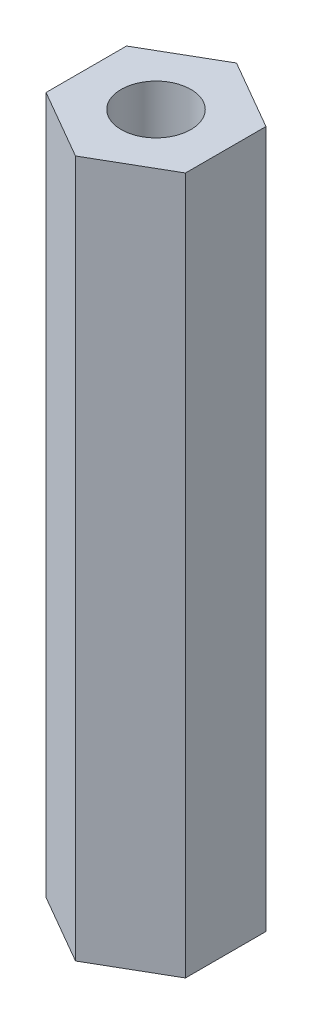
ISO-10303-21;
HEADER;
FILE_DESCRIPTION(('STEP AP214'),'2;1');
FILE_NAME('part.step','',(''),(''),'','','');
FILE_SCHEMA(('AUTOMOTIVE_DESIGN { 1 0 10303 214 1 1 1 1 }'));
ENDSEC;
DATA;
#1=APPLICATION_CONTEXT('core data for automotive mechanical design processes');
#2=APPLICATION_PROTOCOL_DEFINITION('international standard','automotive_design',2000,#1);
#3=PRODUCT_CONTEXT('',#1,'mechanical');
#4=PRODUCT('Part','Part','',(#3));
#5=PRODUCT_RELATED_PRODUCT_CATEGORY('part','',(#4));
#6=PRODUCT_DEFINITION_FORMATION('','',#4);
#7=PRODUCT_DEFINITION_CONTEXT('part definition',#1,'design');
#8=PRODUCT_DEFINITION('design','',#6,#7);
#9=PRODUCT_DEFINITION_SHAPE('','',#8);
#10=(LENGTH_UNIT() NAMED_UNIT(*) SI_UNIT(.MILLI.,.METRE.));
#11=(NAMED_UNIT(*) PLANE_ANGLE_UNIT() SI_UNIT($,.RADIAN.));
#12=(NAMED_UNIT(*) SI_UNIT($,.STERADIAN.) SOLID_ANGLE_UNIT());
#13=UNCERTAINTY_MEASURE_WITH_UNIT(LENGTH_MEASURE(1.E-05),#10,'distance_accuracy_value','');
#14=(GEOMETRIC_REPRESENTATION_CONTEXT(3) GLOBAL_UNCERTAINTY_ASSIGNED_CONTEXT((#13)) GLOBAL_UNIT_ASSIGNED_CONTEXT((#10,
#11,#12)) REPRESENTATION_CONTEXT('',''));
#15=CARTESIAN_POINT('',(0.,0.,0.));
#16=DIRECTION('',(0.,0.,1.));
#17=DIRECTION('',(1.,0.,0.));
#18=AXIS2_PLACEMENT_3D('',#15,#16,#17);
#19=CARTESIAN_POINT('',(0.,20.,0.));
#20=DIRECTION('',(0.,1.,0.));
#21=DIRECTION('',(0.,0.,1.));
#22=AXIS2_PLACEMENT_3D('',#19,#20,#21);
#23=PLANE('',#22);
#24=DIRECTION('',(0.866025403784439,0.,-0.5));
#25=VECTOR('',#24,1.);
#26=CARTESIAN_POINT('',(0.,20.,2.3094010767585));
#27=LINE('',#26,#25);
#28=CARTESIAN_POINT('',(0.,20.,2.3094010767585));
#29=VERTEX_POINT('',#28);
#30=CARTESIAN_POINT('',(2.,20.,1.15470053837925));
#31=VERTEX_POINT('',#30);
#32=EDGE_CURVE('E146',#29,#31,#27,.T.);
#33=ORIENTED_EDGE('',*,*,#32,.T.);
#34=DIRECTION('',(0.,0.,-1.));
#35=VECTOR('',#34,1.);
#36=CARTESIAN_POINT('',(2.,20.,1.15470053837925));
#37=LINE('',#36,#35);
#38=CARTESIAN_POINT('',(2.,20.,-1.15470053837925));
#39=VERTEX_POINT('',#38);
#40=EDGE_CURVE('E94',#31,#39,#37,.T.);
#41=ORIENTED_EDGE('',*,*,#40,.T.);
#42=DIRECTION('',(-0.866025403784439,0.,-0.5));
#43=VECTOR('',#42,1.);
#44=CARTESIAN_POINT('',(2.,20.,-1.15470053837925));
#45=LINE('',#44,#43);
#46=CARTESIAN_POINT('',(0.,20.,-2.3094010767585));
#47=VERTEX_POINT('',#46);
#48=EDGE_CURVE('E107',#39,#47,#45,.T.);
#49=ORIENTED_EDGE('',*,*,#48,.T.);
#50=DIRECTION('',(-0.866025403784439,0.,0.5));
#51=VECTOR('',#50,1.);
#52=CARTESIAN_POINT('',(0.,20.,-2.3094010767585));
#53=LINE('',#52,#51);
#54=CARTESIAN_POINT('',(-2.,20.,-1.15470053837925));
#55=VERTEX_POINT('',#54);
#56=EDGE_CURVE('E101',#47,#55,#53,.T.);
#57=ORIENTED_EDGE('',*,*,#56,.T.);
#58=DIRECTION('',(0.,0.,1.));
#59=VECTOR('',#58,1.);
#60=CARTESIAN_POINT('',(-2.,20.,-1.15470053837925));
#61=LINE('',#60,#59);
#62=CARTESIAN_POINT('',(-2.,20.,1.15470053837925));
#63=VERTEX_POINT('',#62);
#64=EDGE_CURVE('E105',#55,#63,#61,.T.);
#65=ORIENTED_EDGE('',*,*,#64,.T.);
#66=DIRECTION('',(0.866025403784439,0.,0.5));
#67=VECTOR('',#66,1.);
#68=CARTESIAN_POINT('',(-2.,20.,1.15470053837925));
#69=LINE('',#68,#67);
#70=EDGE_CURVE('E57',#63,#29,#69,.T.);
#71=ORIENTED_EDGE('',*,*,#70,.T.);
#72=EDGE_LOOP('',(#33,#41,#49,#57,#65,#71));
#73=FACE_BOUND('',#72,.T.);
#74=CARTESIAN_POINT('',(0.,20.,0.));
#75=DIRECTION('',(0.,1.,0.));
#76=DIRECTION('',(0.,0.,1.));
#77=AXIS2_PLACEMENT_3D('',#74,#75,#76);
#78=CIRCLE('',#77,1.);
#79=CARTESIAN_POINT('',(0.,20.,1.));
#80=VERTEX_POINT('',#79);
#81=EDGE_CURVE('E134',#80,#80,#78,.T.);
#82=ORIENTED_EDGE('',*,*,#81,.F.);
#83=EDGE_LOOP('',(#82));
#84=FACE_BOUND('',#83,.T.);
#85=ADVANCED_FACE('F39',(#73,#84),#23,.T.);
#86=CARTESIAN_POINT('',(0.,0.,0.));
#87=DIRECTION('',(0.,1.,0.));
#88=DIRECTION('',(0.,0.,1.));
#89=AXIS2_PLACEMENT_3D('',#86,#87,#88);
#90=PLANE('',#89);
#91=DIRECTION('',(0.866025403784439,0.,-0.5));
#92=VECTOR('',#91,1.);
#93=CARTESIAN_POINT('',(0.,0.,2.3094010767585));
#94=LINE('',#93,#92);
#95=CARTESIAN_POINT('',(0.,0.,2.3094010767585));
#96=VERTEX_POINT('',#95);
#97=CARTESIAN_POINT('',(2.,0.,1.15470053837925));
#98=VERTEX_POINT('',#97);
#99=EDGE_CURVE('E129',#96,#98,#94,.T.);
#100=ORIENTED_EDGE('',*,*,#99,.F.);
#101=DIRECTION('',(0.866025403784439,0.,0.5));
#102=VECTOR('',#101,1.);
#103=CARTESIAN_POINT('',(-2.,0.,1.15470053837925));
#104=LINE('',#103,#102);
#105=CARTESIAN_POINT('',(-2.,0.,1.15470053837925));
#106=VERTEX_POINT('',#105);
#107=EDGE_CURVE('E86',#106,#96,#104,.T.);
#108=ORIENTED_EDGE('',*,*,#107,.F.);
#109=DIRECTION('',(0.,0.,1.));
#110=VECTOR('',#109,1.);
#111=CARTESIAN_POINT('',(-2.,0.,-1.15470053837925));
#112=LINE('',#111,#110);
#113=CARTESIAN_POINT('',(-2.,0.,-1.15470053837925));
#114=VERTEX_POINT('',#113);
#115=EDGE_CURVE('E80',#114,#106,#112,.T.);
#116=ORIENTED_EDGE('',*,*,#115,.F.);
#117=DIRECTION('',(-0.866025403784439,0.,0.5));
#118=VECTOR('',#117,1.);
#119=CARTESIAN_POINT('',(0.,0.,-2.3094010767585));
#120=LINE('',#119,#118);
#121=CARTESIAN_POINT('',(0.,0.,-2.3094010767585));
#122=VERTEX_POINT('',#121);
#123=EDGE_CURVE('E116',#122,#114,#120,.T.);
#124=ORIENTED_EDGE('',*,*,#123,.F.);
#125=DIRECTION('',(-0.866025403784439,0.,-0.5));
#126=VECTOR('',#125,1.);
#127=CARTESIAN_POINT('',(2.,0.,-1.15470053837925));
#128=LINE('',#127,#126);
#129=CARTESIAN_POINT('',(2.,0.,-1.15470053837925));
#130=VERTEX_POINT('',#129);
#131=EDGE_CURVE('E137',#130,#122,#128,.T.);
#132=ORIENTED_EDGE('',*,*,#131,.F.);
#133=DIRECTION('',(0.,0.,-1.));
#134=VECTOR('',#133,1.);
#135=CARTESIAN_POINT('',(2.,0.,1.15470053837925));
#136=LINE('',#135,#134);
#137=EDGE_CURVE('E133',#98,#130,#136,.T.);
#138=ORIENTED_EDGE('',*,*,#137,.F.);
#139=EDGE_LOOP('',(#100,#108,#116,#124,#132,#138));
#140=FACE_BOUND('',#139,.T.);
#141=CARTESIAN_POINT('',(0.,0.,0.));
#142=DIRECTION('',(0.,1.,0.));
#143=DIRECTION('',(0.,0.,1.));
#144=AXIS2_PLACEMENT_3D('',#141,#142,#143);
#145=CIRCLE('',#144,1.);
#146=CARTESIAN_POINT('',(0.,0.,1.));
#147=VERTEX_POINT('',#146);
#148=EDGE_CURVE('E243',#147,#147,#145,.T.);
#149=ORIENTED_EDGE('',*,*,#148,.T.);
#150=EDGE_LOOP('',(#149));
#151=FACE_BOUND('',#150,.T.);
#152=ADVANCED_FACE('F159',(#140,#151),#90,.F.);
#153=CARTESIAN_POINT('',(0.,20.,2.3094010767585));
#154=DIRECTION('',(-0.5,0.,-0.866025403784439));
#155=DIRECTION('',(-0.866025403784439,0.,0.5));
#156=AXIS2_PLACEMENT_3D('',#153,#154,#155);
#157=PLANE('',#156);
#158=ORIENTED_EDGE('',*,*,#99,.T.);
#159=DIRECTION('',(0.,-1.,0.));
#160=VECTOR('',#159,1.);
#161=CARTESIAN_POINT('',(2.,20.,1.15470053837925));
#162=LINE('',#161,#160);
#163=EDGE_CURVE('E11',#31,#98,#162,.T.);
#164=ORIENTED_EDGE('',*,*,#163,.F.);
#165=ORIENTED_EDGE('',*,*,#32,.F.);
#166=DIRECTION('',(0.,-1.,0.));
#167=VECTOR('',#166,1.);
#168=CARTESIAN_POINT('',(0.,20.,2.3094010767585));
#169=LINE('',#168,#167);
#170=EDGE_CURVE('E125',#29,#96,#169,.T.);
#171=ORIENTED_EDGE('',*,*,#170,.T.);
#172=EDGE_LOOP('',(#158,#164,#165,#171));
#173=FACE_BOUND('',#172,.T.);
#174=ADVANCED_FACE('F41',(#173),#157,.F.);
#175=CARTESIAN_POINT('',(2.,20.,1.15470053837925));
#176=DIRECTION('',(-1.,0.,0.));
#177=DIRECTION('',(0.,0.,1.));
#178=AXIS2_PLACEMENT_3D('',#175,#176,#177);
#179=PLANE('',#178);
#180=ORIENTED_EDGE('',*,*,#137,.T.);
#181=DIRECTION('',(0.,-1.,0.));
#182=VECTOR('',#181,1.);
#183=CARTESIAN_POINT('',(2.,20.,-1.15470053837925));
#184=LINE('',#183,#182);
#185=EDGE_CURVE('E49',#39,#130,#184,.T.);
#186=ORIENTED_EDGE('',*,*,#185,.F.);
#187=ORIENTED_EDGE('',*,*,#40,.F.);
#188=ORIENTED_EDGE('',*,*,#163,.T.);
#189=EDGE_LOOP('',(#180,#186,#187,#188));
#190=FACE_BOUND('',#189,.T.);
#191=ADVANCED_FACE('F184',(#190),#179,.F.);
#192=CARTESIAN_POINT('',(2.,20.,-1.15470053837925));
#193=DIRECTION('',(-0.5,0.,0.866025403784439));
#194=DIRECTION('',(0.866025403784439,0.,0.5));
#195=AXIS2_PLACEMENT_3D('',#192,#193,#194);
#196=PLANE('',#195);
#197=ORIENTED_EDGE('',*,*,#131,.T.);
#198=DIRECTION('',(0.,-1.,0.));
#199=VECTOR('',#198,1.);
#200=CARTESIAN_POINT('',(0.,20.,-2.3094010767585));
#201=LINE('',#200,#199);
#202=EDGE_CURVE('E118',#47,#122,#201,.T.);
#203=ORIENTED_EDGE('',*,*,#202,.F.);
#204=ORIENTED_EDGE('',*,*,#48,.F.);
#205=ORIENTED_EDGE('',*,*,#185,.T.);
#206=EDGE_LOOP('',(#197,#203,#204,#205));
#207=FACE_BOUND('',#206,.T.);
#208=ADVANCED_FACE('F156',(#207),#196,.F.);
#209=CARTESIAN_POINT('',(0.,20.,-2.3094010767585));
#210=DIRECTION('',(0.5,0.,0.866025403784439));
#211=DIRECTION('',(0.866025403784439,0.,-0.5));
#212=AXIS2_PLACEMENT_3D('',#209,#210,#211);
#213=PLANE('',#212);
#214=ORIENTED_EDGE('',*,*,#123,.T.);
#215=DIRECTION('',(0.,-1.,0.));
#216=VECTOR('',#215,1.);
#217=CARTESIAN_POINT('',(-2.,20.,-1.15470053837925));
#218=LINE('',#217,#216);
#219=EDGE_CURVE('E113',#55,#114,#218,.T.);
#220=ORIENTED_EDGE('',*,*,#219,.F.);
#221=ORIENTED_EDGE('',*,*,#56,.F.);
#222=ORIENTED_EDGE('',*,*,#202,.T.);
#223=EDGE_LOOP('',(#214,#220,#221,#222));
#224=FACE_BOUND('',#223,.T.);
#225=ADVANCED_FACE('F114',(#224),#213,.F.);
#226=CARTESIAN_POINT('',(-2.,20.,-1.15470053837925));
#227=DIRECTION('',(1.,0.,0.));
#228=DIRECTION('',(0.,0.,-1.));
#229=AXIS2_PLACEMENT_3D('',#226,#227,#228);
#230=PLANE('',#229);
#231=ORIENTED_EDGE('',*,*,#115,.T.);
#232=DIRECTION('',(0.,-1.,0.));
#233=VECTOR('',#232,1.);
#234=CARTESIAN_POINT('',(-2.,20.,1.15470053837925));
#235=LINE('',#234,#233);
#236=EDGE_CURVE('E119',#63,#106,#235,.T.);
#237=ORIENTED_EDGE('',*,*,#236,.F.);
#238=ORIENTED_EDGE('',*,*,#64,.F.);
#239=ORIENTED_EDGE('',*,*,#219,.T.);
#240=EDGE_LOOP('',(#231,#237,#238,#239));
#241=FACE_BOUND('',#240,.T.);
#242=ADVANCED_FACE('F121',(#241),#230,.F.);
#243=CARTESIAN_POINT('',(-2.,20.,1.15470053837925));
#244=DIRECTION('',(0.5,0.,-0.866025403784439));
#245=DIRECTION('',(-0.866025403784439,0.,-0.5));
#246=AXIS2_PLACEMENT_3D('',#243,#244,#245);
#247=PLANE('',#246);
#248=ORIENTED_EDGE('',*,*,#107,.T.);
#249=ORIENTED_EDGE('',*,*,#170,.F.);
#250=ORIENTED_EDGE('',*,*,#70,.F.);
#251=ORIENTED_EDGE('',*,*,#236,.T.);
#252=EDGE_LOOP('',(#248,#249,#250,#251));
#253=FACE_BOUND('',#252,.T.);
#254=ADVANCED_FACE('F164',(#253),#247,.F.);
#255=CARTESIAN_POINT('',(0.,20.,0.));
#256=DIRECTION('',(0.,-1.,0.));
#257=DIRECTION('',(0.,0.,-1.));
#258=AXIS2_PLACEMENT_3D('',#255,#256,#257);
#259=CYLINDRICAL_SURFACE('',#258,1.);
#260=ORIENTED_EDGE('',*,*,#81,.T.);
#261=EDGE_LOOP('',(#260));
#262=FACE_BOUND('',#261,.T.);
#263=ORIENTED_EDGE('',*,*,#148,.F.);
#264=EDGE_LOOP('',(#263));
#265=FACE_BOUND('',#264,.T.);
#266=ADVANCED_FACE('F166',(#262,#265),#259,.F.);
#267=CLOSED_SHELL('',(#85,#152,#174,#191,#208,#225,#242,#254,#266));
#268=MANIFOLD_SOLID_BREP('B2',#267);
#269=ADVANCED_BREP_SHAPE_REPRESENTATION('',(#18,#268),#14);
#270=SHAPE_DEFINITION_REPRESENTATION(#9,#269);
ENDSEC;
END-ISO-10303-21;
